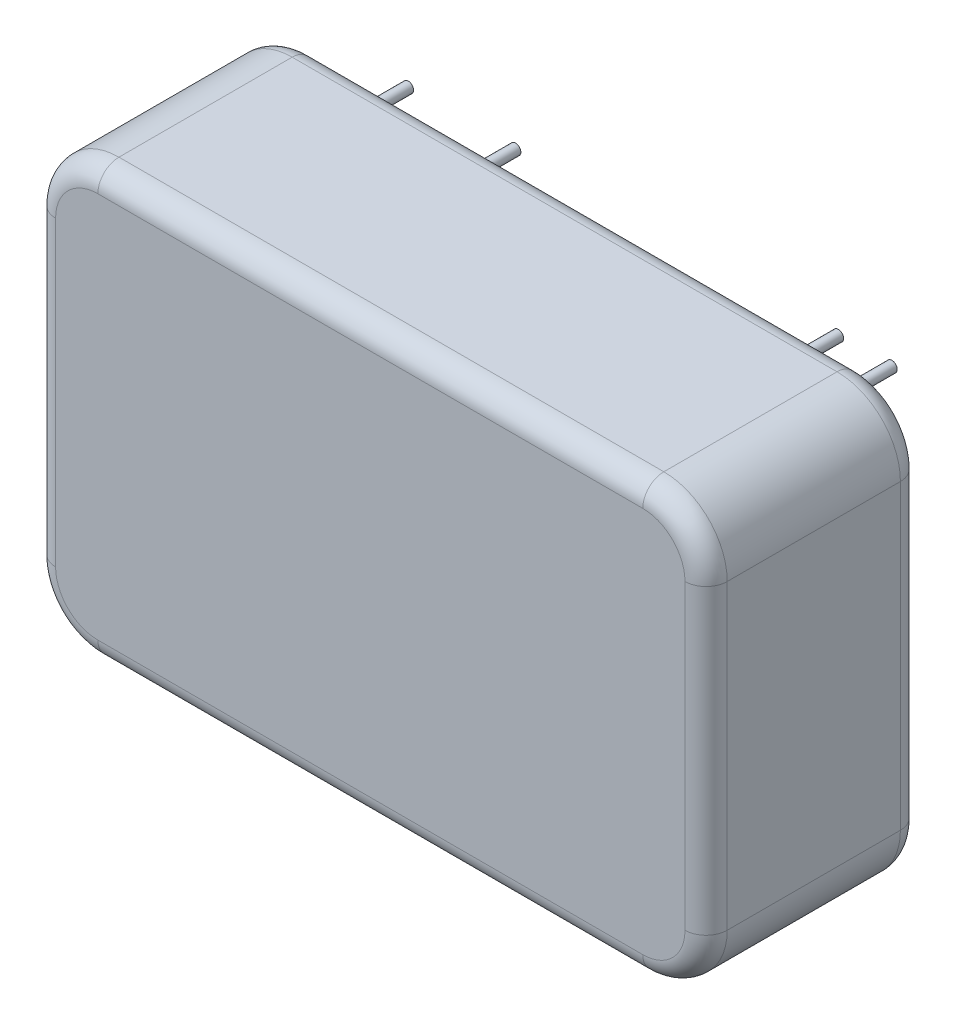
ISO-10303-21;
HEADER;
FILE_DESCRIPTION(('STEP AP214'),'2;1');
FILE_NAME('part.step','',(''),(''),'','','');
FILE_SCHEMA(('AUTOMOTIVE_DESIGN { 1 0 10303 214 1 1 1 1 }'));
ENDSEC;
DATA;
#1=APPLICATION_CONTEXT('core data for automotive mechanical design processes');
#2=APPLICATION_PROTOCOL_DEFINITION('international standard','automotive_design',2000,#1);
#3=PRODUCT_CONTEXT('',#1,'mechanical');
#4=PRODUCT('Part','Part','',(#3));
#5=PRODUCT_RELATED_PRODUCT_CATEGORY('part','',(#4));
#6=PRODUCT_DEFINITION_FORMATION('','',#4);
#7=PRODUCT_DEFINITION_CONTEXT('part definition',#1,'design');
#8=PRODUCT_DEFINITION('design','',#6,#7);
#9=PRODUCT_DEFINITION_SHAPE('','',#8);
#10=(LENGTH_UNIT() NAMED_UNIT(*) SI_UNIT(.MILLI.,.METRE.));
#11=(NAMED_UNIT(*) PLANE_ANGLE_UNIT() SI_UNIT($,.RADIAN.));
#12=(NAMED_UNIT(*) SI_UNIT($,.STERADIAN.) SOLID_ANGLE_UNIT());
#13=UNCERTAINTY_MEASURE_WITH_UNIT(LENGTH_MEASURE(1.E-05),#10,'distance_accuracy_value','');
#14=(GEOMETRIC_REPRESENTATION_CONTEXT(3) GLOBAL_UNCERTAINTY_ASSIGNED_CONTEXT((#13)) GLOBAL_UNIT_ASSIGNED_CONTEXT((#10,
#11,#12)) REPRESENTATION_CONTEXT('',''));
#15=CARTESIAN_POINT('',(0.,0.,0.));
#16=DIRECTION('',(0.,0.,1.));
#17=DIRECTION('',(1.,0.,0.));
#18=AXIS2_PLACEMENT_3D('',#15,#16,#17);
#19=CARTESIAN_POINT('',(0.,0.,10.2));
#20=DIRECTION('',(0.,0.,-1.));
#21=DIRECTION('',(-1.,0.,0.));
#22=AXIS2_PLACEMENT_3D('',#19,#20,#21);
#23=PLANE('',#22);
#24=CARTESIAN_POINT('',(-12.9,7.15,10.2));
#25=DIRECTION('',(0.,0.,-1.));
#26=DIRECTION('',(-1.,0.,0.));
#27=AXIS2_PLACEMENT_3D('',#24,#25,#26);
#28=CIRCLE('',#27,2.);
#29=CARTESIAN_POINT('',(-14.9,7.15,10.2));
#30=VERTEX_POINT('',#29);
#31=CARTESIAN_POINT('',(-12.9,9.15,10.2));
#32=VERTEX_POINT('',#31);
#33=EDGE_CURVE('E205',#30,#32,#28,.T.);
#34=ORIENTED_EDGE('',*,*,#33,.F.);
#35=DIRECTION('',(0.,-1.,0.));
#36=VECTOR('',#35,1.);
#37=CARTESIAN_POINT('',(-14.9,0.,10.2));
#38=LINE('',#37,#36);
#39=CARTESIAN_POINT('',(-14.9,-7.15,10.2));
#40=VERTEX_POINT('',#39);
#41=EDGE_CURVE('E169',#30,#40,#38,.T.);
#42=ORIENTED_EDGE('',*,*,#41,.T.);
#43=CARTESIAN_POINT('',(-12.9,-7.15,10.2));
#44=DIRECTION('',(0.,0.,-1.));
#45=DIRECTION('',(-1.,0.,0.));
#46=AXIS2_PLACEMENT_3D('',#43,#44,#45);
#47=CIRCLE('',#46,2.);
#48=CARTESIAN_POINT('',(-12.9,-9.15,10.2));
#49=VERTEX_POINT('',#48);
#50=EDGE_CURVE('E196',#49,#40,#47,.T.);
#51=ORIENTED_EDGE('',*,*,#50,.F.);
#52=DIRECTION('',(1.,0.,0.));
#53=VECTOR('',#52,1.);
#54=CARTESIAN_POINT('',(0.,-9.15,10.2));
#55=LINE('',#54,#53);
#56=CARTESIAN_POINT('',(12.9,-9.15,10.2));
#57=VERTEX_POINT('',#56);
#58=EDGE_CURVE('E307',#49,#57,#55,.T.);
#59=ORIENTED_EDGE('',*,*,#58,.T.);
#60=CARTESIAN_POINT('',(12.9,-7.15,10.2));
#61=DIRECTION('',(0.,0.,-1.));
#62=DIRECTION('',(-1.,0.,0.));
#63=AXIS2_PLACEMENT_3D('',#60,#61,#62);
#64=CIRCLE('',#63,2.);
#65=CARTESIAN_POINT('',(14.9,-7.15,10.2));
#66=VERTEX_POINT('',#65);
#67=EDGE_CURVE('E199',#66,#57,#64,.T.);
#68=ORIENTED_EDGE('',*,*,#67,.F.);
#69=DIRECTION('',(0.,1.,0.));
#70=VECTOR('',#69,1.);
#71=CARTESIAN_POINT('',(14.9,0.,10.2));
#72=LINE('',#71,#70);
#73=CARTESIAN_POINT('',(14.9,7.15,10.2));
#74=VERTEX_POINT('',#73);
#75=EDGE_CURVE('E310',#66,#74,#72,.T.);
#76=ORIENTED_EDGE('',*,*,#75,.T.);
#77=CARTESIAN_POINT('',(12.9,7.15,10.2));
#78=DIRECTION('',(0.,0.,-1.));
#79=DIRECTION('',(-1.,0.,0.));
#80=AXIS2_PLACEMENT_3D('',#77,#78,#79);
#81=CIRCLE('',#80,2.);
#82=CARTESIAN_POINT('',(12.9,9.15,10.2));
#83=VERTEX_POINT('',#82);
#84=EDGE_CURVE('E202',#83,#74,#81,.T.);
#85=ORIENTED_EDGE('',*,*,#84,.F.);
#86=DIRECTION('',(-1.,0.,0.));
#87=VECTOR('',#86,1.);
#88=CARTESIAN_POINT('',(0.,9.15,10.2));
#89=LINE('',#88,#87);
#90=EDGE_CURVE('E186',#83,#32,#89,.T.);
#91=ORIENTED_EDGE('',*,*,#90,.T.);
#92=EDGE_LOOP('',(#34,#42,#51,#59,#68,#76,#85,#91));
#93=FACE_BOUND('',#92,.T.);
#94=ADVANCED_FACE('F35',(#93),#23,.F.);
#95=CARTESIAN_POINT('',(0.,0.,0.));
#96=DIRECTION('',(0.,0.,-1.));
#97=DIRECTION('',(-1.,0.,0.));
#98=AXIS2_PLACEMENT_3D('',#95,#96,#97);
#99=PLANE('',#98);
#100=CARTESIAN_POINT('',(-11.45,-7.62,0.));
#101=DIRECTION('',(0.,0.,-1.));
#102=DIRECTION('',(-1.,0.,0.));
#103=AXIS2_PLACEMENT_3D('',#100,#101,#102);
#104=CIRCLE('',#103,0.25);
#105=CARTESIAN_POINT('',(-11.7,-7.62,0.));
#106=VERTEX_POINT('',#105);
#107=EDGE_CURVE('E642',#106,#106,#104,.T.);
#108=ORIENTED_EDGE('',*,*,#107,.F.);
#109=EDGE_LOOP('',(#108));
#110=FACE_BOUND('',#109,.T.);
#111=CARTESIAN_POINT('',(-6.37,-7.62,0.));
#112=DIRECTION('',(0.,0.,-1.));
#113=DIRECTION('',(-1.,0.,0.));
#114=AXIS2_PLACEMENT_3D('',#111,#112,#113);
#115=CIRCLE('',#114,0.25);
#116=CARTESIAN_POINT('',(-6.62,-7.62,0.));
#117=VERTEX_POINT('',#116);
#118=EDGE_CURVE('E641',#117,#117,#115,.T.);
#119=ORIENTED_EDGE('',*,*,#118,.F.);
#120=EDGE_LOOP('',(#119));
#121=FACE_BOUND('',#120,.T.);
#122=CARTESIAN_POINT('',(8.91,-7.62,0.));
#123=DIRECTION('',(0.,0.,-1.));
#124=DIRECTION('',(-1.,0.,0.));
#125=AXIS2_PLACEMENT_3D('',#122,#123,#124);
#126=CIRCLE('',#125,0.25);
#127=CARTESIAN_POINT('',(8.66,-7.62,0.));
#128=VERTEX_POINT('',#127);
#129=EDGE_CURVE('E651',#128,#128,#126,.T.);
#130=ORIENTED_EDGE('',*,*,#129,.F.);
#131=EDGE_LOOP('',(#130));
#132=FACE_BOUND('',#131,.T.);
#133=CARTESIAN_POINT('',(11.45,-7.62,0.));
#134=DIRECTION('',(0.,0.,-1.));
#135=DIRECTION('',(-1.,0.,0.));
#136=AXIS2_PLACEMENT_3D('',#133,#134,#135);
#137=CIRCLE('',#136,0.25);
#138=CARTESIAN_POINT('',(11.2,-7.62,0.));
#139=VERTEX_POINT('',#138);
#140=EDGE_CURVE('E656',#139,#139,#137,.T.);
#141=ORIENTED_EDGE('',*,*,#140,.F.);
#142=EDGE_LOOP('',(#141));
#143=FACE_BOUND('',#142,.T.);
#144=CARTESIAN_POINT('',(11.45,7.62,0.));
#145=DIRECTION('',(0.,0.,-1.));
#146=DIRECTION('',(-1.,0.,0.));
#147=AXIS2_PLACEMENT_3D('',#144,#145,#146);
#148=CIRCLE('',#147,0.25);
#149=CARTESIAN_POINT('',(11.2,7.62,0.));
#150=VERTEX_POINT('',#149);
#151=EDGE_CURVE('E662',#150,#150,#148,.T.);
#152=ORIENTED_EDGE('',*,*,#151,.F.);
#153=EDGE_LOOP('',(#152));
#154=FACE_BOUND('',#153,.T.);
#155=CARTESIAN_POINT('',(8.91,7.62,0.));
#156=DIRECTION('',(0.,0.,-1.));
#157=DIRECTION('',(-1.,0.,0.));
#158=AXIS2_PLACEMENT_3D('',#155,#156,#157);
#159=CIRCLE('',#158,0.25);
#160=CARTESIAN_POINT('',(8.66,7.62,0.));
#161=VERTEX_POINT('',#160);
#162=EDGE_CURVE('E668',#161,#161,#159,.T.);
#163=ORIENTED_EDGE('',*,*,#162,.F.);
#164=EDGE_LOOP('',(#163));
#165=FACE_BOUND('',#164,.T.);
#166=CARTESIAN_POINT('',(-6.37,7.62,0.));
#167=DIRECTION('',(0.,0.,-1.));
#168=DIRECTION('',(-1.,0.,0.));
#169=AXIS2_PLACEMENT_3D('',#166,#167,#168);
#170=CIRCLE('',#169,0.25);
#171=CARTESIAN_POINT('',(-6.62,7.62,0.));
#172=VERTEX_POINT('',#171);
#173=EDGE_CURVE('E273',#172,#172,#170,.T.);
#174=ORIENTED_EDGE('',*,*,#173,.F.);
#175=EDGE_LOOP('',(#174));
#176=FACE_BOUND('',#175,.T.);
#177=CARTESIAN_POINT('',(-11.45,7.62,0.));
#178=DIRECTION('',(0.,0.,-1.));
#179=DIRECTION('',(-1.,0.,0.));
#180=AXIS2_PLACEMENT_3D('',#177,#178,#179);
#181=CIRCLE('',#180,0.25);
#182=CARTESIAN_POINT('',(-11.7,7.62,0.));
#183=VERTEX_POINT('',#182);
#184=EDGE_CURVE('E265',#183,#183,#181,.T.);
#185=ORIENTED_EDGE('',*,*,#184,.F.);
#186=EDGE_LOOP('',(#185));
#187=FACE_BOUND('',#186,.T.);
#188=CARTESIAN_POINT('',(-12.9,7.15,0.));
#189=DIRECTION('',(0.,0.,-1.));
#190=DIRECTION('',(-1.,0.,0.));
#191=AXIS2_PLACEMENT_3D('',#188,#189,#190);
#192=CIRCLE('',#191,2.);
#193=CARTESIAN_POINT('',(-12.9,9.15,0.));
#194=VERTEX_POINT('',#193);
#195=CARTESIAN_POINT('',(-14.9,7.15,0.));
#196=VERTEX_POINT('',#195);
#197=EDGE_CURVE('E181',#194,#196,#192,.F.);
#198=ORIENTED_EDGE('',*,*,#197,.F.);
#199=DIRECTION('',(-1.,0.,0.));
#200=VECTOR('',#199,1.);
#201=CARTESIAN_POINT('',(15.9,9.15,0.));
#202=LINE('',#201,#200);
#203=CARTESIAN_POINT('',(12.9,9.15,0.));
#204=VERTEX_POINT('',#203);
#205=EDGE_CURVE('E289',#194,#204,#202,.F.);
#206=ORIENTED_EDGE('',*,*,#205,.T.);
#207=CARTESIAN_POINT('',(12.9,7.15,0.));
#208=DIRECTION('',(0.,0.,-1.));
#209=DIRECTION('',(-1.,0.,0.));
#210=AXIS2_PLACEMENT_3D('',#207,#208,#209);
#211=CIRCLE('',#210,2.);
#212=CARTESIAN_POINT('',(14.9,7.15,0.));
#213=VERTEX_POINT('',#212);
#214=EDGE_CURVE('E192',#213,#204,#211,.F.);
#215=ORIENTED_EDGE('',*,*,#214,.F.);
#216=DIRECTION('',(0.,1.,0.));
#217=VECTOR('',#216,1.);
#218=CARTESIAN_POINT('',(14.9,-10.15,0.));
#219=LINE('',#218,#217);
#220=CARTESIAN_POINT('',(14.9,-7.15,0.));
#221=VERTEX_POINT('',#220);
#222=EDGE_CURVE('E286',#213,#221,#219,.F.);
#223=ORIENTED_EDGE('',*,*,#222,.T.);
#224=CARTESIAN_POINT('',(12.9,-7.15,0.));
#225=DIRECTION('',(0.,0.,-1.));
#226=DIRECTION('',(-1.,0.,0.));
#227=AXIS2_PLACEMENT_3D('',#224,#225,#226);
#228=CIRCLE('',#227,2.);
#229=CARTESIAN_POINT('',(12.9,-9.15,0.));
#230=VERTEX_POINT('',#229);
#231=EDGE_CURVE('E184',#230,#221,#228,.F.);
#232=ORIENTED_EDGE('',*,*,#231,.F.);
#233=DIRECTION('',(1.,0.,0.));
#234=VECTOR('',#233,1.);
#235=CARTESIAN_POINT('',(-15.9,-9.15,0.));
#236=LINE('',#235,#234);
#237=CARTESIAN_POINT('',(-12.9,-9.15,0.));
#238=VERTEX_POINT('',#237);
#239=EDGE_CURVE('E283',#230,#238,#236,.F.);
#240=ORIENTED_EDGE('',*,*,#239,.T.);
#241=CARTESIAN_POINT('',(-12.9,-7.15,0.));
#242=DIRECTION('',(0.,0.,-1.));
#243=DIRECTION('',(-1.,0.,0.));
#244=AXIS2_PLACEMENT_3D('',#241,#242,#243);
#245=CIRCLE('',#244,2.);
#246=CARTESIAN_POINT('',(-14.9,-7.15,0.));
#247=VERTEX_POINT('',#246);
#248=EDGE_CURVE('E182',#247,#238,#245,.F.);
#249=ORIENTED_EDGE('',*,*,#248,.F.);
#250=DIRECTION('',(0.,-1.,0.));
#251=VECTOR('',#250,1.);
#252=CARTESIAN_POINT('',(-14.9,10.15,0.));
#253=LINE('',#252,#251);
#254=EDGE_CURVE('E281',#247,#196,#253,.F.);
#255=ORIENTED_EDGE('',*,*,#254,.T.);
#256=EDGE_LOOP('',(#198,#206,#215,#223,#232,#240,#249,#255));
#257=FACE_BOUND('',#256,.T.);
#258=ADVANCED_FACE('F342',(#110,#121,#132,#143,#154,#165,#176,#187,#257),#99,.T.);
#259=CARTESIAN_POINT('',(15.9,-10.15,10.2));
#260=DIRECTION('',(-1.,0.,0.));
#261=DIRECTION('',(0.,0.,1.));
#262=AXIS2_PLACEMENT_3D('',#259,#260,#261);
#263=PLANE('',#262);
#264=DIRECTION('',(0.,1.,0.));
#265=VECTOR('',#264,1.);
#266=CARTESIAN_POINT('',(15.9,-10.15,9.2));
#267=LINE('',#266,#265);
#268=CARTESIAN_POINT('',(15.9,7.15,9.2));
#269=VERTEX_POINT('',#268);
#270=CARTESIAN_POINT('',(15.9,-7.15,9.2));
#271=VERTEX_POINT('',#270);
#272=EDGE_CURVE('E292',#269,#271,#267,.F.);
#273=ORIENTED_EDGE('',*,*,#272,.T.);
#274=DIRECTION('',(0.,0.,-1.));
#275=VECTOR('',#274,1.);
#276=CARTESIAN_POINT('',(15.9,-7.15,10.2));
#277=LINE('',#276,#275);
#278=CARTESIAN_POINT('',(15.9,-7.15,0.999999999999999));
#279=VERTEX_POINT('',#278);
#280=EDGE_CURVE('E242',#271,#279,#277,.T.);
#281=ORIENTED_EDGE('',*,*,#280,.T.);
#282=DIRECTION('',(0.,1.,0.));
#283=VECTOR('',#282,1.);
#284=CARTESIAN_POINT('',(15.9,10.15,0.999999999999999));
#285=LINE('',#284,#283);
#286=CARTESIAN_POINT('',(15.9,7.15,0.999999999999999));
#287=VERTEX_POINT('',#286);
#288=EDGE_CURVE('E295',#279,#287,#285,.T.);
#289=ORIENTED_EDGE('',*,*,#288,.T.);
#290=DIRECTION('',(0.,0.,-1.));
#291=VECTOR('',#290,1.);
#292=CARTESIAN_POINT('',(15.9,7.15,10.2));
#293=LINE('',#292,#291);
#294=EDGE_CURVE('E240',#287,#269,#293,.F.);
#295=ORIENTED_EDGE('',*,*,#294,.T.);
#296=EDGE_LOOP('',(#273,#281,#289,#295));
#297=FACE_BOUND('',#296,.T.);
#298=ADVANCED_FACE('F389',(#297),#263,.F.);
#299=CARTESIAN_POINT('',(-15.9,10.15,10.2));
#300=DIRECTION('',(0.,-1.,0.));
#301=DIRECTION('',(0.,0.,-1.));
#302=AXIS2_PLACEMENT_3D('',#299,#300,#301);
#303=PLANE('',#302);
#304=DIRECTION('',(-1.,0.,0.));
#305=VECTOR('',#304,1.);
#306=CARTESIAN_POINT('',(-15.9,10.15,9.2));
#307=LINE('',#306,#305);
#308=CARTESIAN_POINT('',(-12.9,10.15,9.2));
#309=VERTEX_POINT('',#308);
#310=CARTESIAN_POINT('',(12.9,10.15,9.2));
#311=VERTEX_POINT('',#310);
#312=EDGE_CURVE('E246',#309,#311,#307,.F.);
#313=ORIENTED_EDGE('',*,*,#312,.T.);
#314=DIRECTION('',(0.,0.,-1.));
#315=VECTOR('',#314,1.);
#316=CARTESIAN_POINT('',(12.9,10.15,10.2));
#317=LINE('',#316,#315);
#318=CARTESIAN_POINT('',(12.9,10.15,0.999999999999999));
#319=VERTEX_POINT('',#318);
#320=EDGE_CURVE('E11',#311,#319,#317,.T.);
#321=ORIENTED_EDGE('',*,*,#320,.T.);
#322=DIRECTION('',(-1.,0.,0.));
#323=VECTOR('',#322,1.);
#324=CARTESIAN_POINT('',(-15.9,10.15,0.999999999999999));
#325=LINE('',#324,#323);
#326=CARTESIAN_POINT('',(-12.9,10.15,0.999999999999999));
#327=VERTEX_POINT('',#326);
#328=EDGE_CURVE('E278',#319,#327,#325,.T.);
#329=ORIENTED_EDGE('',*,*,#328,.T.);
#330=DIRECTION('',(0.,0.,-1.));
#331=VECTOR('',#330,1.);
#332=CARTESIAN_POINT('',(-12.9,10.15,10.2));
#333=LINE('',#332,#331);
#334=EDGE_CURVE('E44',#327,#309,#333,.F.);
#335=ORIENTED_EDGE('',*,*,#334,.T.);
#336=EDGE_LOOP('',(#313,#321,#329,#335));
#337=FACE_BOUND('',#336,.T.);
#338=ADVANCED_FACE('F324',(#337),#303,.F.);
#339=CARTESIAN_POINT('',(-15.9,-10.15,10.2));
#340=DIRECTION('',(1.,0.,0.));
#341=DIRECTION('',(0.,0.,-1.));
#342=AXIS2_PLACEMENT_3D('',#339,#340,#341);
#343=PLANE('',#342);
#344=DIRECTION('',(0.,-1.,0.));
#345=VECTOR('',#344,1.);
#346=CARTESIAN_POINT('',(-15.9,-10.15,0.999999999999999));
#347=LINE('',#346,#345);
#348=CARTESIAN_POINT('',(-15.9,7.15,0.999999999999999));
#349=VERTEX_POINT('',#348);
#350=CARTESIAN_POINT('',(-15.9,-7.15,0.999999999999999));
#351=VERTEX_POINT('',#350);
#352=EDGE_CURVE('E152',#349,#351,#347,.T.);
#353=ORIENTED_EDGE('',*,*,#352,.T.);
#354=DIRECTION('',(0.,0.,-1.));
#355=VECTOR('',#354,1.);
#356=CARTESIAN_POINT('',(-15.9,-7.15,10.2));
#357=LINE('',#356,#355);
#358=CARTESIAN_POINT('',(-15.9,-7.15,9.2));
#359=VERTEX_POINT('',#358);
#360=EDGE_CURVE('E59',#351,#359,#357,.F.);
#361=ORIENTED_EDGE('',*,*,#360,.T.);
#362=DIRECTION('',(0.,-1.,0.));
#363=VECTOR('',#362,1.);
#364=CARTESIAN_POINT('',(-15.9,-10.15,9.2));
#365=LINE('',#364,#363);
#366=CARTESIAN_POINT('',(-15.9,7.15,9.2));
#367=VERTEX_POINT('',#366);
#368=EDGE_CURVE('E153',#359,#367,#365,.F.);
#369=ORIENTED_EDGE('',*,*,#368,.T.);
#370=DIRECTION('',(0.,0.,-1.));
#371=VECTOR('',#370,1.);
#372=CARTESIAN_POINT('',(-15.9,7.15,10.2));
#373=LINE('',#372,#371);
#374=EDGE_CURVE('E149',#367,#349,#373,.T.);
#375=ORIENTED_EDGE('',*,*,#374,.T.);
#376=EDGE_LOOP('',(#353,#361,#369,#375));
#377=FACE_BOUND('',#376,.T.);
#378=ADVANCED_FACE('F151',(#377),#343,.F.);
#379=CARTESIAN_POINT('',(-15.9,-10.15,10.2));
#380=DIRECTION('',(0.,1.,0.));
#381=DIRECTION('',(0.,0.,1.));
#382=AXIS2_PLACEMENT_3D('',#379,#380,#381);
#383=PLANE('',#382);
#384=DIRECTION('',(1.,0.,0.));
#385=VECTOR('',#384,1.);
#386=CARTESIAN_POINT('',(-15.9,-10.15,9.2));
#387=LINE('',#386,#385);
#388=CARTESIAN_POINT('',(12.9,-10.15,9.2));
#389=VERTEX_POINT('',#388);
#390=CARTESIAN_POINT('',(-12.9,-10.15,9.2));
#391=VERTEX_POINT('',#390);
#392=EDGE_CURVE('E298',#389,#391,#387,.F.);
#393=ORIENTED_EDGE('',*,*,#392,.T.);
#394=DIRECTION('',(0.,0.,-1.));
#395=VECTOR('',#394,1.);
#396=CARTESIAN_POINT('',(-12.9,-10.15,10.2));
#397=LINE('',#396,#395);
#398=CARTESIAN_POINT('',(-12.9,-10.15,0.999999999999999));
#399=VERTEX_POINT('',#398);
#400=EDGE_CURVE('E158',#391,#399,#397,.T.);
#401=ORIENTED_EDGE('',*,*,#400,.T.);
#402=DIRECTION('',(1.,0.,0.));
#403=VECTOR('',#402,1.);
#404=CARTESIAN_POINT('',(15.9,-10.15,0.999999999999999));
#405=LINE('',#404,#403);
#406=CARTESIAN_POINT('',(12.9,-10.15,0.999999999999999));
#407=VERTEX_POINT('',#406);
#408=EDGE_CURVE('E301',#399,#407,#405,.T.);
#409=ORIENTED_EDGE('',*,*,#408,.T.);
#410=DIRECTION('',(0.,0.,-1.));
#411=VECTOR('',#410,1.);
#412=CARTESIAN_POINT('',(12.9,-10.15,10.2));
#413=LINE('',#412,#411);
#414=EDGE_CURVE('E236',#407,#389,#413,.F.);
#415=ORIENTED_EDGE('',*,*,#414,.T.);
#416=EDGE_LOOP('',(#393,#401,#409,#415));
#417=FACE_BOUND('',#416,.T.);
#418=ADVANCED_FACE('F356',(#417),#383,.F.);
#419=CARTESIAN_POINT('',(-15.9,-9.15,0.999999999999999));
#420=DIRECTION('',(-1.,0.,0.));
#421=DIRECTION('',(0.,0.,1.));
#422=AXIS2_PLACEMENT_3D('',#419,#420,#421);
#423=CYLINDRICAL_SURFACE('',#422,1.);
#424=ORIENTED_EDGE('',*,*,#408,.F.);
#425=CARTESIAN_POINT('',(-12.9,-9.15,0.999999999999999));
#426=DIRECTION('',(1.,0.,0.));
#427=DIRECTION('',(0.,0.,-1.));
#428=AXIS2_PLACEMENT_3D('',#425,#426,#427);
#429=CIRCLE('',#428,1.);
#430=EDGE_CURVE('E230',#399,#238,#429,.T.);
#431=ORIENTED_EDGE('',*,*,#430,.T.);
#432=ORIENTED_EDGE('',*,*,#239,.F.);
#433=CARTESIAN_POINT('',(12.9,-9.15,1.));
#434=DIRECTION('',(-1.,0.,0.));
#435=DIRECTION('',(0.,0.,1.));
#436=AXIS2_PLACEMENT_3D('',#433,#434,#435);
#437=CIRCLE('',#436,1.);
#438=EDGE_CURVE('E228',#230,#407,#437,.T.);
#439=ORIENTED_EDGE('',*,*,#438,.T.);
#440=EDGE_LOOP('',(#424,#431,#432,#439));
#441=FACE_BOUND('',#440,.T.);
#442=ADVANCED_FACE('F348',(#441),#423,.T.);
#443=CARTESIAN_POINT('',(14.9,-10.15,0.999999999999999));
#444=DIRECTION('',(0.,-1.,0.));
#445=DIRECTION('',(0.,0.,-1.));
#446=AXIS2_PLACEMENT_3D('',#443,#444,#445);
#447=CYLINDRICAL_SURFACE('',#446,1.);
#448=ORIENTED_EDGE('',*,*,#288,.F.);
#449=CARTESIAN_POINT('',(14.9,-7.15,0.999999999999999));
#450=DIRECTION('',(0.,1.,0.));
#451=DIRECTION('',(0.,0.,1.));
#452=AXIS2_PLACEMENT_3D('',#449,#450,#451);
#453=CIRCLE('',#452,1.);
#454=EDGE_CURVE('E222',#279,#221,#453,.T.);
#455=ORIENTED_EDGE('',*,*,#454,.T.);
#456=ORIENTED_EDGE('',*,*,#222,.F.);
#457=CARTESIAN_POINT('',(14.9,7.15,1.));
#458=DIRECTION('',(0.,-1.,0.));
#459=DIRECTION('',(0.,0.,-1.));
#460=AXIS2_PLACEMENT_3D('',#457,#458,#459);
#461=CIRCLE('',#460,1.);
#462=EDGE_CURVE('E220',#213,#287,#461,.T.);
#463=ORIENTED_EDGE('',*,*,#462,.T.);
#464=EDGE_LOOP('',(#448,#455,#456,#463));
#465=FACE_BOUND('',#464,.T.);
#466=ADVANCED_FACE('F408',(#465),#447,.T.);
#467=CARTESIAN_POINT('',(-14.9,-10.15,0.999999999999999));
#468=DIRECTION('',(0.,1.,0.));
#469=DIRECTION('',(0.,0.,1.));
#470=AXIS2_PLACEMENT_3D('',#467,#468,#469);
#471=CYLINDRICAL_SURFACE('',#470,1.);
#472=ORIENTED_EDGE('',*,*,#352,.F.);
#473=CARTESIAN_POINT('',(-14.9,7.15,0.999999999999999));
#474=DIRECTION('',(0.,-1.,0.));
#475=DIRECTION('',(0.,0.,-1.));
#476=AXIS2_PLACEMENT_3D('',#473,#474,#475);
#477=CIRCLE('',#476,1.);
#478=EDGE_CURVE('E165',#349,#196,#477,.T.);
#479=ORIENTED_EDGE('',*,*,#478,.T.);
#480=ORIENTED_EDGE('',*,*,#254,.F.);
#481=CARTESIAN_POINT('',(-14.9,-7.15,1.));
#482=DIRECTION('',(0.,1.,0.));
#483=DIRECTION('',(0.,0.,1.));
#484=AXIS2_PLACEMENT_3D('',#481,#482,#483);
#485=CIRCLE('',#484,1.);
#486=EDGE_CURVE('E168',#247,#351,#485,.T.);
#487=ORIENTED_EDGE('',*,*,#486,.T.);
#488=EDGE_LOOP('',(#472,#479,#480,#487));
#489=FACE_BOUND('',#488,.T.);
#490=ADVANCED_FACE('F162',(#489),#471,.T.);
#491=CARTESIAN_POINT('',(-15.9,9.15,0.999999999999999));
#492=DIRECTION('',(1.,0.,0.));
#493=DIRECTION('',(0.,0.,-1.));
#494=AXIS2_PLACEMENT_3D('',#491,#492,#493);
#495=CYLINDRICAL_SURFACE('',#494,1.);
#496=ORIENTED_EDGE('',*,*,#328,.F.);
#497=CARTESIAN_POINT('',(12.9,9.15,0.999999999999999));
#498=DIRECTION('',(-1.,0.,0.));
#499=DIRECTION('',(0.,0.,1.));
#500=AXIS2_PLACEMENT_3D('',#497,#498,#499);
#501=CIRCLE('',#500,1.);
#502=EDGE_CURVE('E214',#319,#204,#501,.T.);
#503=ORIENTED_EDGE('',*,*,#502,.T.);
#504=ORIENTED_EDGE('',*,*,#205,.F.);
#505=CARTESIAN_POINT('',(-12.9,9.15,1.));
#506=DIRECTION('',(1.,0.,0.));
#507=DIRECTION('',(0.,0.,-1.));
#508=AXIS2_PLACEMENT_3D('',#505,#506,#507);
#509=CIRCLE('',#508,1.);
#510=EDGE_CURVE('E212',#194,#327,#509,.T.);
#511=ORIENTED_EDGE('',*,*,#510,.T.);
#512=EDGE_LOOP('',(#496,#503,#504,#511));
#513=FACE_BOUND('',#512,.T.);
#514=ADVANCED_FACE('F340',(#513),#495,.T.);
#515=CARTESIAN_POINT('',(0.,-9.15,9.2));
#516=DIRECTION('',(1.,0.,0.));
#517=DIRECTION('',(0.,0.,-1.));
#518=AXIS2_PLACEMENT_3D('',#515,#516,#517);
#519=CYLINDRICAL_SURFACE('',#518,1.);
#520=ORIENTED_EDGE('',*,*,#392,.F.);
#521=CARTESIAN_POINT('',(12.9,-9.15,9.2));
#522=DIRECTION('',(-1.,0.,0.));
#523=DIRECTION('',(0.,0.,1.));
#524=AXIS2_PLACEMENT_3D('',#521,#522,#523);
#525=CIRCLE('',#524,1.);
#526=EDGE_CURVE('E226',#389,#57,#525,.T.);
#527=ORIENTED_EDGE('',*,*,#526,.T.);
#528=ORIENTED_EDGE('',*,*,#58,.F.);
#529=CARTESIAN_POINT('',(-12.9,-9.15,9.2));
#530=DIRECTION('',(1.,0.,0.));
#531=DIRECTION('',(0.,0.,-1.));
#532=AXIS2_PLACEMENT_3D('',#529,#530,#531);
#533=CIRCLE('',#532,1.);
#534=EDGE_CURVE('E224',#49,#391,#533,.T.);
#535=ORIENTED_EDGE('',*,*,#534,.T.);
#536=EDGE_LOOP('',(#520,#527,#528,#535));
#537=FACE_BOUND('',#536,.T.);
#538=ADVANCED_FACE('F369',(#537),#519,.T.);
#539=CARTESIAN_POINT('',(14.9,0.,9.2));
#540=DIRECTION('',(0.,1.,0.));
#541=DIRECTION('',(0.,0.,1.));
#542=AXIS2_PLACEMENT_3D('',#539,#540,#541);
#543=CYLINDRICAL_SURFACE('',#542,1.);
#544=ORIENTED_EDGE('',*,*,#272,.F.);
#545=CARTESIAN_POINT('',(14.9,7.15,9.2));
#546=DIRECTION('',(0.,-1.,0.));
#547=DIRECTION('',(0.,0.,-1.));
#548=AXIS2_PLACEMENT_3D('',#545,#546,#547);
#549=CIRCLE('',#548,1.);
#550=EDGE_CURVE('E218',#269,#74,#549,.T.);
#551=ORIENTED_EDGE('',*,*,#550,.T.);
#552=ORIENTED_EDGE('',*,*,#75,.F.);
#553=CARTESIAN_POINT('',(14.9,-7.15,9.2));
#554=DIRECTION('',(0.,1.,0.));
#555=DIRECTION('',(0.,0.,1.));
#556=AXIS2_PLACEMENT_3D('',#553,#554,#555);
#557=CIRCLE('',#556,1.);
#558=EDGE_CURVE('E216',#66,#271,#557,.T.);
#559=ORIENTED_EDGE('',*,*,#558,.T.);
#560=EDGE_LOOP('',(#544,#551,#552,#559));
#561=FACE_BOUND('',#560,.T.);
#562=ADVANCED_FACE('F419',(#561),#543,.T.);
#563=CARTESIAN_POINT('',(-14.9,0.,9.2));
#564=DIRECTION('',(0.,-1.,0.));
#565=DIRECTION('',(0.,0.,-1.));
#566=AXIS2_PLACEMENT_3D('',#563,#564,#565);
#567=CYLINDRICAL_SURFACE('',#566,1.);
#568=ORIENTED_EDGE('',*,*,#368,.F.);
#569=CARTESIAN_POINT('',(-14.9,-7.15,9.2));
#570=DIRECTION('',(0.,1.,0.));
#571=DIRECTION('',(0.,0.,1.));
#572=AXIS2_PLACEMENT_3D('',#569,#570,#571);
#573=CIRCLE('',#572,1.);
#574=EDGE_CURVE('E234',#359,#40,#573,.T.);
#575=ORIENTED_EDGE('',*,*,#574,.T.);
#576=ORIENTED_EDGE('',*,*,#41,.F.);
#577=CARTESIAN_POINT('',(-14.9,7.15,9.2));
#578=DIRECTION('',(0.,-1.,0.));
#579=DIRECTION('',(0.,0.,-1.));
#580=AXIS2_PLACEMENT_3D('',#577,#578,#579);
#581=CIRCLE('',#580,1.);
#582=EDGE_CURVE('E52',#30,#367,#581,.T.);
#583=ORIENTED_EDGE('',*,*,#582,.T.);
#584=EDGE_LOOP('',(#568,#575,#576,#583));
#585=FACE_BOUND('',#584,.T.);
#586=ADVANCED_FACE('F416',(#585),#567,.T.);
#587=CARTESIAN_POINT('',(0.,9.15,9.2));
#588=DIRECTION('',(-1.,0.,0.));
#589=DIRECTION('',(0.,0.,1.));
#590=AXIS2_PLACEMENT_3D('',#587,#588,#589);
#591=CYLINDRICAL_SURFACE('',#590,1.);
#592=ORIENTED_EDGE('',*,*,#312,.F.);
#593=CARTESIAN_POINT('',(-12.9,9.15,9.2));
#594=DIRECTION('',(1.,0.,0.));
#595=DIRECTION('',(0.,0.,-1.));
#596=AXIS2_PLACEMENT_3D('',#593,#594,#595);
#597=CIRCLE('',#596,1.);
#598=EDGE_CURVE('E210',#309,#32,#597,.T.);
#599=ORIENTED_EDGE('',*,*,#598,.T.);
#600=ORIENTED_EDGE('',*,*,#90,.F.);
#601=CARTESIAN_POINT('',(12.9,9.15,9.2));
#602=DIRECTION('',(-1.,0.,0.));
#603=DIRECTION('',(0.,0.,1.));
#604=AXIS2_PLACEMENT_3D('',#601,#602,#603);
#605=CIRCLE('',#604,1.);
#606=EDGE_CURVE('E208',#83,#311,#605,.T.);
#607=ORIENTED_EDGE('',*,*,#606,.T.);
#608=EDGE_LOOP('',(#592,#599,#600,#607));
#609=FACE_BOUND('',#608,.T.);
#610=ADVANCED_FACE('F321',(#609),#591,.T.);
#611=CARTESIAN_POINT('',(-12.9,7.15,9.2));
#612=DIRECTION('',(0.,0.,-1.));
#613=DIRECTION('',(-1.,0.,0.));
#614=AXIS2_PLACEMENT_3D('',#611,#612,#613);
#615=TOROIDAL_SURFACE('',#614,2.,1.);
#616=ORIENTED_EDGE('',*,*,#33,.T.);
#617=ORIENTED_EDGE('',*,*,#598,.F.);
#618=CARTESIAN_POINT('',(-12.9,7.15,9.2));
#619=DIRECTION('',(0.,0.,-1.));
#620=DIRECTION('',(-1.,0.,0.));
#621=AXIS2_PLACEMENT_3D('',#618,#619,#620);
#622=CIRCLE('',#621,3.);
#623=EDGE_CURVE('E177',#367,#309,#622,.T.);
#624=ORIENTED_EDGE('',*,*,#623,.F.);
#625=ORIENTED_EDGE('',*,*,#582,.F.);
#626=EDGE_LOOP('',(#616,#617,#624,#625));
#627=FACE_BOUND('',#626,.T.);
#628=ADVANCED_FACE('F319',(#627),#615,.T.);
#629=CARTESIAN_POINT('',(-12.9,7.15,10.2));
#630=DIRECTION('',(0.,0.,-1.));
#631=DIRECTION('',(-1.,0.,0.));
#632=AXIS2_PLACEMENT_3D('',#629,#630,#631);
#633=CYLINDRICAL_SURFACE('',#632,3.);
#634=ORIENTED_EDGE('',*,*,#623,.T.);
#635=ORIENTED_EDGE('',*,*,#334,.F.);
#636=CARTESIAN_POINT('',(-12.9,7.15,0.999999999999999));
#637=DIRECTION('',(0.,0.,-1.));
#638=DIRECTION('',(-1.,0.,0.));
#639=AXIS2_PLACEMENT_3D('',#636,#637,#638);
#640=CIRCLE('',#639,3.);
#641=EDGE_CURVE('E173',#349,#327,#640,.T.);
#642=ORIENTED_EDGE('',*,*,#641,.F.);
#643=ORIENTED_EDGE('',*,*,#374,.F.);
#644=EDGE_LOOP('',(#634,#635,#642,#643));
#645=FACE_BOUND('',#644,.T.);
#646=ADVANCED_FACE('F174',(#645),#633,.T.);
#647=CARTESIAN_POINT('',(-12.9,7.15,0.999999999999999));
#648=DIRECTION('',(0.,0.,-1.));
#649=DIRECTION('',(-1.,0.,0.));
#650=AXIS2_PLACEMENT_3D('',#647,#648,#649);
#651=TOROIDAL_SURFACE('',#650,2.,1.);
#652=ORIENTED_EDGE('',*,*,#478,.F.);
#653=ORIENTED_EDGE('',*,*,#641,.T.);
#654=ORIENTED_EDGE('',*,*,#510,.F.);
#655=ORIENTED_EDGE('',*,*,#197,.T.);
#656=EDGE_LOOP('',(#652,#653,#654,#655));
#657=FACE_BOUND('',#656,.T.);
#658=ADVANCED_FACE('F180',(#657),#651,.T.);
#659=CARTESIAN_POINT('',(12.9,7.15,9.2));
#660=DIRECTION('',(0.,0.,-1.));
#661=DIRECTION('',(-1.,0.,0.));
#662=AXIS2_PLACEMENT_3D('',#659,#660,#661);
#663=TOROIDAL_SURFACE('',#662,2.,1.);
#664=ORIENTED_EDGE('',*,*,#84,.T.);
#665=ORIENTED_EDGE('',*,*,#550,.F.);
#666=CARTESIAN_POINT('',(12.9,7.15,9.2));
#667=DIRECTION('',(0.,0.,-1.));
#668=DIRECTION('',(-1.,0.,0.));
#669=AXIS2_PLACEMENT_3D('',#666,#667,#668);
#670=CIRCLE('',#669,3.);
#671=EDGE_CURVE('E178',#311,#269,#670,.T.);
#672=ORIENTED_EDGE('',*,*,#671,.F.);
#673=ORIENTED_EDGE('',*,*,#606,.F.);
#674=EDGE_LOOP('',(#664,#665,#672,#673));
#675=FACE_BOUND('',#674,.T.);
#676=ADVANCED_FACE('F329',(#675),#663,.T.);
#677=CARTESIAN_POINT('',(12.9,7.15,10.2));
#678=DIRECTION('',(0.,0.,-1.));
#679=DIRECTION('',(-1.,0.,0.));
#680=AXIS2_PLACEMENT_3D('',#677,#678,#679);
#681=CYLINDRICAL_SURFACE('',#680,3.);
#682=ORIENTED_EDGE('',*,*,#671,.T.);
#683=ORIENTED_EDGE('',*,*,#294,.F.);
#684=CARTESIAN_POINT('',(12.9,7.15,0.999999999999999));
#685=DIRECTION('',(0.,0.,-1.));
#686=DIRECTION('',(-1.,0.,0.));
#687=AXIS2_PLACEMENT_3D('',#684,#685,#686);
#688=CIRCLE('',#687,3.);
#689=EDGE_CURVE('E247',#319,#287,#688,.T.);
#690=ORIENTED_EDGE('',*,*,#689,.F.);
#691=ORIENTED_EDGE('',*,*,#320,.F.);
#692=EDGE_LOOP('',(#682,#683,#690,#691));
#693=FACE_BOUND('',#692,.T.);
#694=ADVANCED_FACE('F333',(#693),#681,.T.);
#695=CARTESIAN_POINT('',(12.9,7.15,0.999999999999999));
#696=DIRECTION('',(0.,0.,-1.));
#697=DIRECTION('',(-1.,0.,0.));
#698=AXIS2_PLACEMENT_3D('',#695,#696,#697);
#699=TOROIDAL_SURFACE('',#698,2.,1.);
#700=ORIENTED_EDGE('',*,*,#462,.F.);
#701=ORIENTED_EDGE('',*,*,#214,.T.);
#702=ORIENTED_EDGE('',*,*,#502,.F.);
#703=ORIENTED_EDGE('',*,*,#689,.T.);
#704=EDGE_LOOP('',(#700,#701,#702,#703));
#705=FACE_BOUND('',#704,.T.);
#706=ADVANCED_FACE('F336',(#705),#699,.T.);
#707=CARTESIAN_POINT('',(12.9,-7.15,9.2));
#708=DIRECTION('',(0.,0.,-1.));
#709=DIRECTION('',(-1.,0.,0.));
#710=AXIS2_PLACEMENT_3D('',#707,#708,#709);
#711=TOROIDAL_SURFACE('',#710,2.,1.);
#712=ORIENTED_EDGE('',*,*,#67,.T.);
#713=ORIENTED_EDGE('',*,*,#526,.F.);
#714=CARTESIAN_POINT('',(12.9,-7.15,9.2));
#715=DIRECTION('',(0.,0.,-1.));
#716=DIRECTION('',(-1.,0.,0.));
#717=AXIS2_PLACEMENT_3D('',#714,#715,#716);
#718=CIRCLE('',#717,3.);
#719=EDGE_CURVE('E250',#271,#389,#718,.T.);
#720=ORIENTED_EDGE('',*,*,#719,.F.);
#721=ORIENTED_EDGE('',*,*,#558,.F.);
#722=EDGE_LOOP('',(#712,#713,#720,#721));
#723=FACE_BOUND('',#722,.T.);
#724=ADVANCED_FACE('F366',(#723),#711,.T.);
#725=CARTESIAN_POINT('',(12.9,-7.15,10.2));
#726=DIRECTION('',(0.,0.,-1.));
#727=DIRECTION('',(-1.,0.,0.));
#728=AXIS2_PLACEMENT_3D('',#725,#726,#727);
#729=CYLINDRICAL_SURFACE('',#728,3.);
#730=ORIENTED_EDGE('',*,*,#719,.T.);
#731=ORIENTED_EDGE('',*,*,#414,.F.);
#732=CARTESIAN_POINT('',(12.9,-7.15,0.999999999999999));
#733=DIRECTION('',(0.,0.,-1.));
#734=DIRECTION('',(-1.,0.,0.));
#735=AXIS2_PLACEMENT_3D('',#732,#733,#734);
#736=CIRCLE('',#735,3.);
#737=EDGE_CURVE('E253',#279,#407,#736,.T.);
#738=ORIENTED_EDGE('',*,*,#737,.F.);
#739=ORIENTED_EDGE('',*,*,#280,.F.);
#740=EDGE_LOOP('',(#730,#731,#738,#739));
#741=FACE_BOUND('',#740,.T.);
#742=ADVANCED_FACE('F360',(#741),#729,.T.);
#743=CARTESIAN_POINT('',(12.9,-7.15,0.999999999999999));
#744=DIRECTION('',(0.,0.,-1.));
#745=DIRECTION('',(-1.,0.,0.));
#746=AXIS2_PLACEMENT_3D('',#743,#744,#745);
#747=TOROIDAL_SURFACE('',#746,2.,1.);
#748=ORIENTED_EDGE('',*,*,#438,.F.);
#749=ORIENTED_EDGE('',*,*,#231,.T.);
#750=ORIENTED_EDGE('',*,*,#454,.F.);
#751=ORIENTED_EDGE('',*,*,#737,.T.);
#752=EDGE_LOOP('',(#748,#749,#750,#751));
#753=FACE_BOUND('',#752,.T.);
#754=ADVANCED_FACE('F352',(#753),#747,.T.);
#755=CARTESIAN_POINT('',(-12.9,-7.15,9.2));
#756=DIRECTION('',(0.,0.,-1.));
#757=DIRECTION('',(-1.,0.,0.));
#758=AXIS2_PLACEMENT_3D('',#755,#756,#757);
#759=TOROIDAL_SURFACE('',#758,2.,1.);
#760=ORIENTED_EDGE('',*,*,#50,.T.);
#761=ORIENTED_EDGE('',*,*,#574,.F.);
#762=CARTESIAN_POINT('',(-12.9,-7.15,9.2));
#763=DIRECTION('',(0.,0.,-1.));
#764=DIRECTION('',(-1.,0.,0.));
#765=AXIS2_PLACEMENT_3D('',#762,#763,#764);
#766=CIRCLE('',#765,3.);
#767=EDGE_CURVE('E39',#391,#359,#766,.T.);
#768=ORIENTED_EDGE('',*,*,#767,.F.);
#769=ORIENTED_EDGE('',*,*,#534,.F.);
#770=EDGE_LOOP('',(#760,#761,#768,#769));
#771=FACE_BOUND('',#770,.T.);
#772=ADVANCED_FACE('F37',(#771),#759,.T.);
#773=CARTESIAN_POINT('',(-12.9,-7.15,10.2));
#774=DIRECTION('',(0.,0.,-1.));
#775=DIRECTION('',(-1.,0.,0.));
#776=AXIS2_PLACEMENT_3D('',#773,#774,#775);
#777=CYLINDRICAL_SURFACE('',#776,3.);
#778=ORIENTED_EDGE('',*,*,#767,.T.);
#779=ORIENTED_EDGE('',*,*,#360,.F.);
#780=CARTESIAN_POINT('',(-12.9,-7.15,0.999999999999999));
#781=DIRECTION('',(0.,0.,-1.));
#782=DIRECTION('',(-1.,0.,0.));
#783=AXIS2_PLACEMENT_3D('',#780,#781,#782);
#784=CIRCLE('',#783,3.);
#785=EDGE_CURVE('E257',#399,#351,#784,.T.);
#786=ORIENTED_EDGE('',*,*,#785,.F.);
#787=ORIENTED_EDGE('',*,*,#400,.F.);
#788=EDGE_LOOP('',(#778,#779,#786,#787));
#789=FACE_BOUND('',#788,.T.);
#790=ADVANCED_FACE('F376',(#789),#777,.T.);
#791=CARTESIAN_POINT('',(-12.9,-7.15,0.999999999999999));
#792=DIRECTION('',(0.,0.,-1.));
#793=DIRECTION('',(-1.,0.,0.));
#794=AXIS2_PLACEMENT_3D('',#791,#792,#793);
#795=TOROIDAL_SURFACE('',#794,2.,1.);
#796=ORIENTED_EDGE('',*,*,#430,.F.);
#797=ORIENTED_EDGE('',*,*,#785,.T.);
#798=ORIENTED_EDGE('',*,*,#486,.F.);
#799=ORIENTED_EDGE('',*,*,#248,.T.);
#800=EDGE_LOOP('',(#796,#797,#798,#799));
#801=FACE_BOUND('',#800,.T.);
#802=ADVANCED_FACE('F344',(#801),#795,.T.);
#803=CARTESIAN_POINT('',(-11.45,7.62,-3.05));
#804=DIRECTION('',(0.,0.,1.));
#805=DIRECTION('',(1.,0.,0.));
#806=AXIS2_PLACEMENT_3D('',#803,#804,#805);
#807=CYLINDRICAL_SURFACE('',#806,0.25);
#808=CARTESIAN_POINT('',(-11.45,7.62,-3.05));
#809=DIRECTION('',(0.,0.,-1.));
#810=DIRECTION('',(-1.,0.,0.));
#811=AXIS2_PLACEMENT_3D('',#808,#809,#810);
#812=CIRCLE('',#811,0.25);
#813=CARTESIAN_POINT('',(-11.7,7.62,-3.05));
#814=VERTEX_POINT('',#813);
#815=EDGE_CURVE('E259',#814,#814,#812,.T.);
#816=ORIENTED_EDGE('',*,*,#815,.F.);
#817=EDGE_LOOP('',(#816));
#818=FACE_BOUND('',#817,.T.);
#819=ORIENTED_EDGE('',*,*,#184,.T.);
#820=EDGE_LOOP('',(#819));
#821=FACE_BOUND('',#820,.T.);
#822=ADVANCED_FACE('F382',(#818,#821),#807,.T.);
#823=CARTESIAN_POINT('',(-11.45,7.62,-3.05));
#824=DIRECTION('',(0.,0.,-1.));
#825=DIRECTION('',(-1.,0.,0.));
#826=AXIS2_PLACEMENT_3D('',#823,#824,#825);
#827=PLANE('',#826);
#828=ORIENTED_EDGE('',*,*,#815,.T.);
#829=EDGE_LOOP('',(#828));
#830=FACE_BOUND('',#829,.T.);
#831=ADVANCED_FACE('F487',(#830),#827,.T.);
#832=CARTESIAN_POINT('',(-6.37,7.62,-3.05));
#833=DIRECTION('',(0.,0.,1.));
#834=DIRECTION('',(1.,0.,0.));
#835=AXIS2_PLACEMENT_3D('',#832,#833,#834);
#836=CYLINDRICAL_SURFACE('',#835,0.25);
#837=CARTESIAN_POINT('',(-6.37,7.62,-3.05));
#838=DIRECTION('',(0.,0.,-1.));
#839=DIRECTION('',(-1.,0.,0.));
#840=AXIS2_PLACEMENT_3D('',#837,#838,#839);
#841=CIRCLE('',#840,0.25);
#842=CARTESIAN_POINT('',(-6.62,7.62,-3.05));
#843=VERTEX_POINT('',#842);
#844=EDGE_CURVE('E270',#843,#843,#841,.T.);
#845=ORIENTED_EDGE('',*,*,#844,.F.);
#846=EDGE_LOOP('',(#845));
#847=FACE_BOUND('',#846,.T.);
#848=ORIENTED_EDGE('',*,*,#173,.T.);
#849=EDGE_LOOP('',(#848));
#850=FACE_BOUND('',#849,.T.);
#851=ADVANCED_FACE('F496',(#847,#850),#836,.T.);
#852=CARTESIAN_POINT('',(-6.37,7.62,-3.05));
#853=DIRECTION('',(0.,0.,-1.));
#854=DIRECTION('',(-1.,0.,0.));
#855=AXIS2_PLACEMENT_3D('',#852,#853,#854);
#856=PLANE('',#855);
#857=ORIENTED_EDGE('',*,*,#844,.T.);
#858=EDGE_LOOP('',(#857));
#859=FACE_BOUND('',#858,.T.);
#860=ADVANCED_FACE('F504',(#859),#856,.T.);
#861=CARTESIAN_POINT('',(8.91,7.62,-3.05));
#862=DIRECTION('',(0.,0.,1.));
#863=DIRECTION('',(1.,0.,0.));
#864=AXIS2_PLACEMENT_3D('',#861,#862,#863);
#865=CYLINDRICAL_SURFACE('',#864,0.25);
#866=CARTESIAN_POINT('',(8.91,7.62,-3.05));
#867=DIRECTION('',(0.,0.,-1.));
#868=DIRECTION('',(-1.,0.,0.));
#869=AXIS2_PLACEMENT_3D('',#866,#867,#868);
#870=CIRCLE('',#869,0.25);
#871=CARTESIAN_POINT('',(8.66,7.62,-3.05));
#872=VERTEX_POINT('',#871);
#873=EDGE_CURVE('E671',#872,#872,#870,.T.);
#874=ORIENTED_EDGE('',*,*,#873,.F.);
#875=EDGE_LOOP('',(#874));
#876=FACE_BOUND('',#875,.T.);
#877=ORIENTED_EDGE('',*,*,#162,.T.);
#878=EDGE_LOOP('',(#877));
#879=FACE_BOUND('',#878,.T.);
#880=ADVANCED_FACE('F514',(#876,#879),#865,.T.);
#881=CARTESIAN_POINT('',(8.91,7.62,-3.05));
#882=DIRECTION('',(0.,0.,-1.));
#883=DIRECTION('',(-1.,0.,0.));
#884=AXIS2_PLACEMENT_3D('',#881,#882,#883);
#885=PLANE('',#884);
#886=ORIENTED_EDGE('',*,*,#873,.T.);
#887=EDGE_LOOP('',(#886));
#888=FACE_BOUND('',#887,.T.);
#889=ADVANCED_FACE('F524',(#888),#885,.T.);
#890=CARTESIAN_POINT('',(11.45,7.62,-3.05));
#891=DIRECTION('',(0.,0.,1.));
#892=DIRECTION('',(1.,0.,0.));
#893=AXIS2_PLACEMENT_3D('',#890,#891,#892);
#894=CYLINDRICAL_SURFACE('',#893,0.25);
#895=CARTESIAN_POINT('',(11.45,7.62,-3.05));
#896=DIRECTION('',(0.,0.,-1.));
#897=DIRECTION('',(-1.,0.,0.));
#898=AXIS2_PLACEMENT_3D('',#895,#896,#897);
#899=CIRCLE('',#898,0.25);
#900=CARTESIAN_POINT('',(11.2,7.62,-3.05));
#901=VERTEX_POINT('',#900);
#902=EDGE_CURVE('E665',#901,#901,#899,.T.);
#903=ORIENTED_EDGE('',*,*,#902,.F.);
#904=EDGE_LOOP('',(#903));
#905=FACE_BOUND('',#904,.T.);
#906=ORIENTED_EDGE('',*,*,#151,.T.);
#907=EDGE_LOOP('',(#906));
#908=FACE_BOUND('',#907,.T.);
#909=ADVANCED_FACE('F534',(#905,#908),#894,.T.);
#910=CARTESIAN_POINT('',(11.45,7.62,-3.05));
#911=DIRECTION('',(0.,0.,-1.));
#912=DIRECTION('',(-1.,0.,0.));
#913=AXIS2_PLACEMENT_3D('',#910,#911,#912);
#914=PLANE('',#913);
#915=ORIENTED_EDGE('',*,*,#902,.T.);
#916=EDGE_LOOP('',(#915));
#917=FACE_BOUND('',#916,.T.);
#918=ADVANCED_FACE('F544',(#917),#914,.T.);
#919=CARTESIAN_POINT('',(11.45,-7.62,-3.05));
#920=DIRECTION('',(0.,0.,1.));
#921=DIRECTION('',(1.,0.,0.));
#922=AXIS2_PLACEMENT_3D('',#919,#920,#921);
#923=CYLINDRICAL_SURFACE('',#922,0.25);
#924=CARTESIAN_POINT('',(11.45,-7.62,-3.05));
#925=DIRECTION('',(0.,0.,-1.));
#926=DIRECTION('',(-1.,0.,0.));
#927=AXIS2_PLACEMENT_3D('',#924,#925,#926);
#928=CIRCLE('',#927,0.25);
#929=CARTESIAN_POINT('',(11.2,-7.62,-3.05));
#930=VERTEX_POINT('',#929);
#931=EDGE_CURVE('E659',#930,#930,#928,.T.);
#932=ORIENTED_EDGE('',*,*,#931,.F.);
#933=EDGE_LOOP('',(#932));
#934=FACE_BOUND('',#933,.T.);
#935=ORIENTED_EDGE('',*,*,#140,.T.);
#936=EDGE_LOOP('',(#935));
#937=FACE_BOUND('',#936,.T.);
#938=ADVANCED_FACE('F554',(#934,#937),#923,.T.);
#939=CARTESIAN_POINT('',(11.45,-7.62,-3.05));
#940=DIRECTION('',(0.,0.,-1.));
#941=DIRECTION('',(-1.,0.,0.));
#942=AXIS2_PLACEMENT_3D('',#939,#940,#941);
#943=PLANE('',#942);
#944=ORIENTED_EDGE('',*,*,#931,.T.);
#945=EDGE_LOOP('',(#944));
#946=FACE_BOUND('',#945,.T.);
#947=ADVANCED_FACE('F564',(#946),#943,.T.);
#948=CARTESIAN_POINT('',(8.91,-7.62,-3.05));
#949=DIRECTION('',(0.,0.,1.));
#950=DIRECTION('',(1.,0.,0.));
#951=AXIS2_PLACEMENT_3D('',#948,#949,#950);
#952=CYLINDRICAL_SURFACE('',#951,0.25);
#953=CARTESIAN_POINT('',(8.91,-7.62,-3.05));
#954=DIRECTION('',(0.,0.,-1.));
#955=DIRECTION('',(-1.,0.,0.));
#956=AXIS2_PLACEMENT_3D('',#953,#954,#955);
#957=CIRCLE('',#956,0.25);
#958=CARTESIAN_POINT('',(8.66,-7.62,-3.05));
#959=VERTEX_POINT('',#958);
#960=EDGE_CURVE('E653',#959,#959,#957,.T.);
#961=ORIENTED_EDGE('',*,*,#960,.F.);
#962=EDGE_LOOP('',(#961));
#963=FACE_BOUND('',#962,.T.);
#964=ORIENTED_EDGE('',*,*,#129,.T.);
#965=EDGE_LOOP('',(#964));
#966=FACE_BOUND('',#965,.T.);
#967=ADVANCED_FACE('F574',(#963,#966),#952,.T.);
#968=CARTESIAN_POINT('',(8.91,-7.62,-3.05));
#969=DIRECTION('',(0.,0.,-1.));
#970=DIRECTION('',(-1.,0.,0.));
#971=AXIS2_PLACEMENT_3D('',#968,#969,#970);
#972=PLANE('',#971);
#973=ORIENTED_EDGE('',*,*,#960,.T.);
#974=EDGE_LOOP('',(#973));
#975=FACE_BOUND('',#974,.T.);
#976=ADVANCED_FACE('F584',(#975),#972,.T.);
#977=CARTESIAN_POINT('',(-6.37,-7.62,-3.05));
#978=DIRECTION('',(0.,0.,1.));
#979=DIRECTION('',(1.,0.,0.));
#980=AXIS2_PLACEMENT_3D('',#977,#978,#979);
#981=CYLINDRICAL_SURFACE('',#980,0.25);
#982=CARTESIAN_POINT('',(-6.37,-7.62,-3.05));
#983=DIRECTION('',(0.,0.,-1.));
#984=DIRECTION('',(-1.,0.,0.));
#985=AXIS2_PLACEMENT_3D('',#982,#983,#984);
#986=CIRCLE('',#985,0.25);
#987=CARTESIAN_POINT('',(-6.62,-7.62,-3.05));
#988=VERTEX_POINT('',#987);
#989=EDGE_CURVE('E645',#988,#988,#986,.T.);
#990=ORIENTED_EDGE('',*,*,#989,.F.);
#991=EDGE_LOOP('',(#990));
#992=FACE_BOUND('',#991,.T.);
#993=ORIENTED_EDGE('',*,*,#118,.T.);
#994=EDGE_LOOP('',(#993));
#995=FACE_BOUND('',#994,.T.);
#996=ADVANCED_FACE('F594',(#992,#995),#981,.T.);
#997=CARTESIAN_POINT('',(-6.37,-7.62,-3.05));
#998=DIRECTION('',(0.,0.,-1.));
#999=DIRECTION('',(-1.,0.,0.));
#1000=AXIS2_PLACEMENT_3D('',#997,#998,#999);
#1001=PLANE('',#1000);
#1002=ORIENTED_EDGE('',*,*,#989,.T.);
#1003=EDGE_LOOP('',(#1002));
#1004=FACE_BOUND('',#1003,.T.);
#1005=ADVANCED_FACE('F604',(#1004),#1001,.T.);
#1006=CARTESIAN_POINT('',(-11.45,-7.62,-3.05));
#1007=DIRECTION('',(0.,0.,1.));
#1008=DIRECTION('',(1.,0.,0.));
#1009=AXIS2_PLACEMENT_3D('',#1006,#1007,#1008);
#1010=CYLINDRICAL_SURFACE('',#1009,0.25);
#1011=CARTESIAN_POINT('',(-11.45,-7.62,-3.05));
#1012=DIRECTION('',(0.,0.,-1.));
#1013=DIRECTION('',(-1.,0.,0.));
#1014=AXIS2_PLACEMENT_3D('',#1011,#1012,#1013);
#1015=CIRCLE('',#1014,0.25);
#1016=CARTESIAN_POINT('',(-11.7,-7.62,-3.05));
#1017=VERTEX_POINT('',#1016);
#1018=EDGE_CURVE('E640',#1017,#1017,#1015,.T.);
#1019=ORIENTED_EDGE('',*,*,#1018,.F.);
#1020=EDGE_LOOP('',(#1019));
#1021=FACE_BOUND('',#1020,.T.);
#1022=ORIENTED_EDGE('',*,*,#107,.T.);
#1023=EDGE_LOOP('',(#1022));
#1024=FACE_BOUND('',#1023,.T.);
#1025=ADVANCED_FACE('F614',(#1021,#1024),#1010,.T.);
#1026=CARTESIAN_POINT('',(-11.45,-7.62,-3.05));
#1027=DIRECTION('',(0.,0.,-1.));
#1028=DIRECTION('',(-1.,0.,0.));
#1029=AXIS2_PLACEMENT_3D('',#1026,#1027,#1028);
#1030=PLANE('',#1029);
#1031=ORIENTED_EDGE('',*,*,#1018,.T.);
#1032=EDGE_LOOP('',(#1031));
#1033=FACE_BOUND('',#1032,.T.);
#1034=ADVANCED_FACE('F624',(#1033),#1030,.T.);
#1035=CLOSED_SHELL('',(#94,#258,#298,#338,#378,#418,#442,#466,#490,#514,#538,#562,#586,#610,
#628,#646,#658,#676,#694,#706,#724,#742,#754,#772,#790,#802,#822,#831,#851,#860,#880,#889,#909,
#918,#938,#947,#967,#976,#996,#1005,#1025,#1034));
#1036=MANIFOLD_SOLID_BREP('B2',#1035);
#1037=ADVANCED_BREP_SHAPE_REPRESENTATION('',(#18,#1036),#14);
#1038=SHAPE_DEFINITION_REPRESENTATION(#9,#1037);
ENDSEC;
END-ISO-10303-21;
